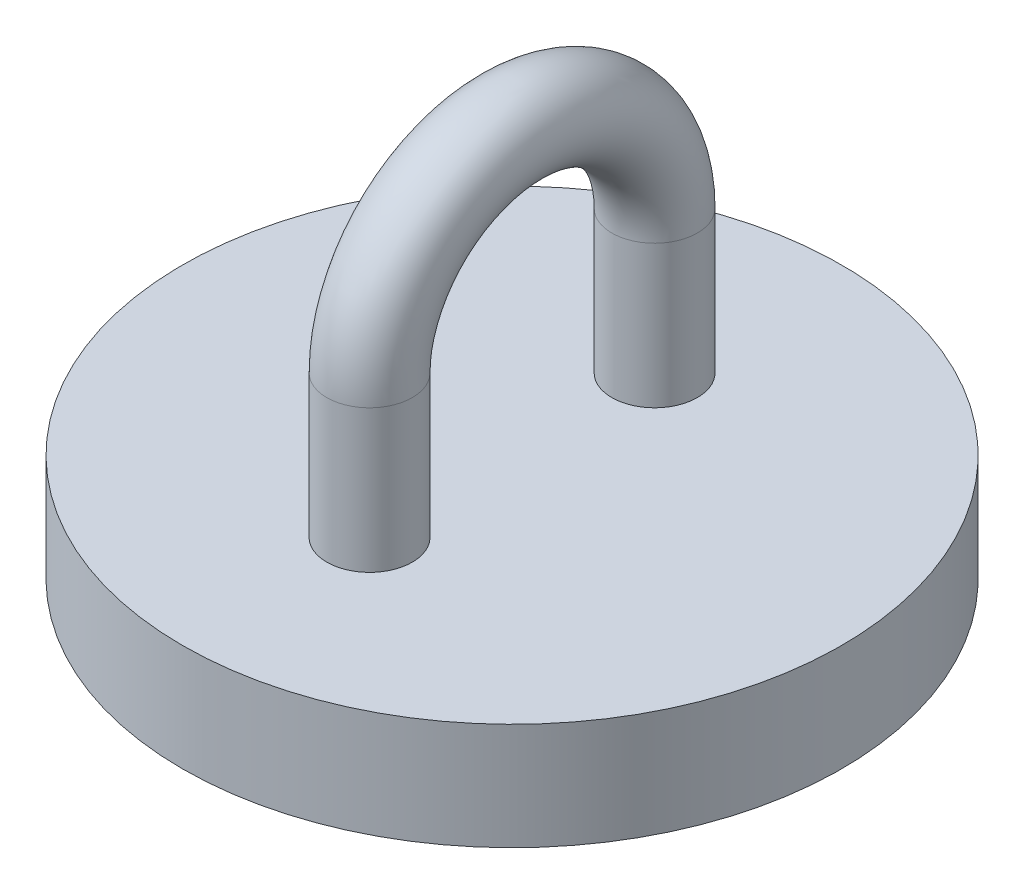
ISO-10303-21;
HEADER;
FILE_DESCRIPTION(('STEP AP214'),'2;1');
FILE_NAME('part.step','',(''),(''),'','','');
FILE_SCHEMA(('AUTOMOTIVE_DESIGN { 1 0 10303 214 1 1 1 1 }'));
ENDSEC;
DATA;
#1=APPLICATION_CONTEXT('core data for automotive mechanical design processes');
#2=APPLICATION_PROTOCOL_DEFINITION('international standard','automotive_design',2000,#1);
#3=PRODUCT_CONTEXT('',#1,'mechanical');
#4=PRODUCT('Part','Part','',(#3));
#5=PRODUCT_RELATED_PRODUCT_CATEGORY('part','',(#4));
#6=PRODUCT_DEFINITION_FORMATION('','',#4);
#7=PRODUCT_DEFINITION_CONTEXT('part definition',#1,'design');
#8=PRODUCT_DEFINITION('design','',#6,#7);
#9=PRODUCT_DEFINITION_SHAPE('','',#8);
#10=(LENGTH_UNIT() NAMED_UNIT(*) SI_UNIT(.MILLI.,.METRE.));
#11=(NAMED_UNIT(*) PLANE_ANGLE_UNIT() SI_UNIT($,.RADIAN.));
#12=(NAMED_UNIT(*) SI_UNIT($,.STERADIAN.) SOLID_ANGLE_UNIT());
#13=UNCERTAINTY_MEASURE_WITH_UNIT(LENGTH_MEASURE(1.E-05),#10,'distance_accuracy_value','');
#14=(GEOMETRIC_REPRESENTATION_CONTEXT(3) GLOBAL_UNCERTAINTY_ASSIGNED_CONTEXT((#13)) GLOBAL_UNIT_ASSIGNED_CONTEXT((#10,
#11,#12)) REPRESENTATION_CONTEXT('',''));
#15=CARTESIAN_POINT('',(0.,0.,0.));
#16=DIRECTION('',(0.,0.,1.));
#17=DIRECTION('',(1.,0.,0.));
#18=AXIS2_PLACEMENT_3D('',#15,#16,#17);
#19=CARTESIAN_POINT('',(0.,3.,0.));
#20=DIRECTION('',(0.,1.,0.));
#21=DIRECTION('',(0.,0.,1.));
#22=AXIS2_PLACEMENT_3D('',#19,#20,#21);
#23=PLANE('',#22);
#24=CARTESIAN_POINT('',(0.,3.,0.));
#25=DIRECTION('',(0.,1.,0.));
#26=DIRECTION('',(0.,0.,1.));
#27=AXIS2_PLACEMENT_3D('',#24,#25,#26);
#28=CIRCLE('',#27,9.25);
#29=CARTESIAN_POINT('',(0.,3.,9.25));
#30=VERTEX_POINT('',#29);
#31=EDGE_CURVE('E46',#30,#30,#28,.T.);
#32=ORIENTED_EDGE('',*,*,#31,.T.);
#33=EDGE_LOOP('',(#32));
#34=FACE_BOUND('',#33,.T.);
#35=CARTESIAN_POINT('',(0.,3.,4.));
#36=DIRECTION('',(0.,1.,0.));
#37=DIRECTION('',(0.,0.,1.));
#38=AXIS2_PLACEMENT_3D('',#35,#36,#37);
#39=CIRCLE('',#38,1.2);
#40=CARTESIAN_POINT('',(0.,3.,5.2));
#41=VERTEX_POINT('',#40);
#42=EDGE_CURVE('E10',#41,#41,#39,.T.);
#43=ORIENTED_EDGE('',*,*,#42,.F.);
#44=EDGE_LOOP('',(#43));
#45=FACE_BOUND('',#44,.T.);
#46=CARTESIAN_POINT('',(0.,3.,-4.));
#47=DIRECTION('',(0.,-1.,0.));
#48=DIRECTION('',(0.,0.,-1.));
#49=AXIS2_PLACEMENT_3D('',#46,#47,#48);
#50=CIRCLE('',#49,1.2);
#51=CARTESIAN_POINT('',(0.,3.,-5.2));
#52=VERTEX_POINT('',#51);
#53=EDGE_CURVE('E61',#52,#52,#50,.T.);
#54=ORIENTED_EDGE('',*,*,#53,.T.);
#55=EDGE_LOOP('',(#54));
#56=FACE_BOUND('',#55,.T.);
#57=ADVANCED_FACE('F37',(#34,#45,#56),#23,.T.);
#58=CARTESIAN_POINT('',(0.,3.,0.));
#59=DIRECTION('',(0.,-1.,0.));
#60=DIRECTION('',(0.,0.,-1.));
#61=AXIS2_PLACEMENT_3D('',#58,#59,#60);
#62=CYLINDRICAL_SURFACE('',#61,9.25);
#63=ORIENTED_EDGE('',*,*,#31,.F.);
#64=EDGE_LOOP('',(#63));
#65=FACE_BOUND('',#64,.T.);
#66=CARTESIAN_POINT('',(0.,0.,0.));
#67=DIRECTION('',(0.,1.,0.));
#68=DIRECTION('',(0.,0.,1.));
#69=AXIS2_PLACEMENT_3D('',#66,#67,#68);
#70=CIRCLE('',#69,9.25);
#71=CARTESIAN_POINT('',(0.,0.,9.25));
#72=VERTEX_POINT('',#71);
#73=EDGE_CURVE('E41',#72,#72,#70,.T.);
#74=ORIENTED_EDGE('',*,*,#73,.T.);
#75=EDGE_LOOP('',(#74));
#76=FACE_BOUND('',#75,.T.);
#77=ADVANCED_FACE('F39',(#65,#76),#62,.T.);
#78=CARTESIAN_POINT('',(0.,0.,0.));
#79=DIRECTION('',(0.,1.,0.));
#80=DIRECTION('',(0.,0.,1.));
#81=AXIS2_PLACEMENT_3D('',#78,#79,#80);
#82=PLANE('',#81);
#83=ORIENTED_EDGE('',*,*,#73,.F.);
#84=EDGE_LOOP('',(#83));
#85=FACE_BOUND('',#84,.T.);
#86=ADVANCED_FACE('F71',(#85),#82,.F.);
#87=CARTESIAN_POINT('',(0.,3.,4.));
#88=DIRECTION('',(0.,1.,0.));
#89=DIRECTION('',(0.,0.,1.));
#90=AXIS2_PLACEMENT_3D('',#87,#88,#89);
#91=CYLINDRICAL_SURFACE('',#90,1.2);
#92=CARTESIAN_POINT('',(0.,7.,4.));
#93=DIRECTION('',(0.,1.,0.));
#94=DIRECTION('',(0.,0.,1.));
#95=AXIS2_PLACEMENT_3D('',#92,#93,#94);
#96=CIRCLE('',#95,1.2);
#97=CARTESIAN_POINT('',(0.,7.,5.2));
#98=VERTEX_POINT('',#97);
#99=EDGE_CURVE('E53',#98,#98,#96,.T.);
#100=ORIENTED_EDGE('',*,*,#99,.F.);
#101=EDGE_LOOP('',(#100));
#102=FACE_BOUND('',#101,.T.);
#103=ORIENTED_EDGE('',*,*,#42,.T.);
#104=EDGE_LOOP('',(#103));
#105=FACE_BOUND('',#104,.T.);
#106=ADVANCED_FACE('F73',(#102,#105),#91,.T.);
#107=CARTESIAN_POINT('',(0.,7.,0.));
#108=DIRECTION('',(-1.,0.,0.));
#109=DIRECTION('',(0.,0.,1.));
#110=AXIS2_PLACEMENT_3D('',#107,#108,#109);
#111=TOROIDAL_SURFACE('',#110,4.,1.2);
#112=CARTESIAN_POINT('',(0.,7.,-4.));
#113=DIRECTION('',(0.,-1.,0.));
#114=DIRECTION('',(0.,0.,-1.));
#115=AXIS2_PLACEMENT_3D('',#112,#113,#114);
#116=CIRCLE('',#115,1.2);
#117=CARTESIAN_POINT('',(0.,7.,-5.2));
#118=VERTEX_POINT('',#117);
#119=EDGE_CURVE('E57',#118,#118,#116,.T.);
#120=CARTESIAN_POINT('',(0.,7.,0.));
#121=DIRECTION('',(-1.,0.,0.));
#122=DIRECTION('',(0.,0.,1.));
#123=AXIS2_PLACEMENT_3D('',#120,#121,#122);
#124=CIRCLE('',#123,5.2);
#125=EDGE_CURVE('',#98,#118,#124,.T.);
#126=ORIENTED_EDGE('',*,*,#99,.T.);
#127=ORIENTED_EDGE('',*,*,#119,.F.);
#128=ORIENTED_EDGE('',*,*,#125,.T.);
#129=ORIENTED_EDGE('',*,*,#125,.F.);
#130=EDGE_LOOP('',(#126,#128,#127,#129));
#131=FACE_BOUND('',#130,.T.);
#132=ADVANCED_FACE('F79',(#131),#111,.T.);
#133=CARTESIAN_POINT('',(0.,7.,-4.));
#134=DIRECTION('',(0.,-1.,0.));
#135=DIRECTION('',(0.,0.,-1.));
#136=AXIS2_PLACEMENT_3D('',#133,#134,#135);
#137=CYLINDRICAL_SURFACE('',#136,1.2);
#138=ORIENTED_EDGE('',*,*,#53,.F.);
#139=EDGE_LOOP('',(#138));
#140=FACE_BOUND('',#139,.T.);
#141=ORIENTED_EDGE('',*,*,#119,.T.);
#142=EDGE_LOOP('',(#141));
#143=FACE_BOUND('',#142,.T.);
#144=ADVANCED_FACE('F74',(#140,#143),#137,.T.);
#145=CLOSED_SHELL('',(#57,#77,#86,#106,#132,#144));
#146=MANIFOLD_SOLID_BREP('B2',#145);
#147=ADVANCED_BREP_SHAPE_REPRESENTATION('',(#18,#146),#14);
#148=SHAPE_DEFINITION_REPRESENTATION(#9,#147);
ENDSEC;
END-ISO-10303-21;
